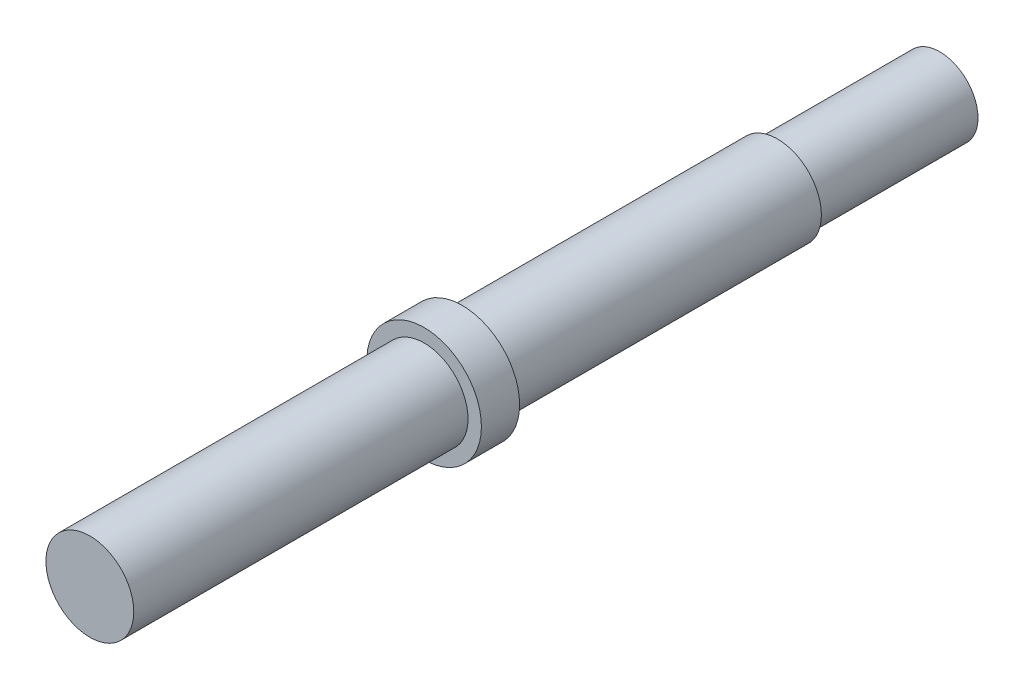
ISO-10303-21;
HEADER;
FILE_DESCRIPTION(('STEP AP214'),'2;1');
FILE_NAME('part.step','',(''),(''),'','','');
FILE_SCHEMA(('AUTOMOTIVE_DESIGN { 1 0 10303 214 1 1 1 1 }'));
ENDSEC;
DATA;
#1=APPLICATION_CONTEXT('core data for automotive mechanical design processes');
#2=APPLICATION_PROTOCOL_DEFINITION('international standard','automotive_design',2000,#1);
#3=PRODUCT_CONTEXT('',#1,'mechanical');
#4=PRODUCT('Part','Part','',(#3));
#5=PRODUCT_RELATED_PRODUCT_CATEGORY('part','',(#4));
#6=PRODUCT_DEFINITION_FORMATION('','',#4);
#7=PRODUCT_DEFINITION_CONTEXT('part definition',#1,'design');
#8=PRODUCT_DEFINITION('design','',#6,#7);
#9=PRODUCT_DEFINITION_SHAPE('','',#8);
#10=(LENGTH_UNIT() NAMED_UNIT(*) SI_UNIT(.MILLI.,.METRE.));
#11=(NAMED_UNIT(*) PLANE_ANGLE_UNIT() SI_UNIT($,.RADIAN.));
#12=(NAMED_UNIT(*) SI_UNIT($,.STERADIAN.) SOLID_ANGLE_UNIT());
#13=UNCERTAINTY_MEASURE_WITH_UNIT(LENGTH_MEASURE(1.E-05),#10,'distance_accuracy_value','');
#14=(GEOMETRIC_REPRESENTATION_CONTEXT(3) GLOBAL_UNCERTAINTY_ASSIGNED_CONTEXT((#13)) GLOBAL_UNIT_ASSIGNED_CONTEXT((#10,
#11,#12)) REPRESENTATION_CONTEXT('',''));
#15=CARTESIAN_POINT('',(0.,0.,0.));
#16=DIRECTION('',(0.,0.,1.));
#17=DIRECTION('',(1.,0.,0.));
#18=AXIS2_PLACEMENT_3D('',#15,#16,#17);
#19=CARTESIAN_POINT('',(0.,0.,84.));
#20=DIRECTION('',(0.,0.,-1.));
#21=DIRECTION('',(-1.,0.,0.));
#22=AXIS2_PLACEMENT_3D('',#19,#20,#21);
#23=CYLINDRICAL_SURFACE('',#22,4.6);
#24=CARTESIAN_POINT('',(0.,0.,12.));
#25=DIRECTION('',(0.,0.,1.));
#26=DIRECTION('',(1.,0.,0.));
#27=AXIS2_PLACEMENT_3D('',#24,#25,#26);
#28=CIRCLE('',#27,4.6);
#29=CARTESIAN_POINT('',(4.6,0.,12.));
#30=VERTEX_POINT('',#29);
#31=EDGE_CURVE('E65',#30,#30,#28,.T.);
#32=ORIENTED_EDGE('',*,*,#31,.T.);
#33=EDGE_LOOP('',(#32));
#34=FACE_BOUND('',#33,.T.);
#35=CARTESIAN_POINT('',(0.,0.,45.));
#36=DIRECTION('',(0.,0.,1.));
#37=DIRECTION('',(1.,0.,0.));
#38=AXIS2_PLACEMENT_3D('',#35,#36,#37);
#39=CIRCLE('',#38,4.6);
#40=CARTESIAN_POINT('',(4.6,0.,45.));
#41=VERTEX_POINT('',#40);
#42=EDGE_CURVE('E10',#41,#41,#39,.T.);
#43=ORIENTED_EDGE('',*,*,#42,.F.);
#44=EDGE_LOOP('',(#43));
#45=FACE_BOUND('',#44,.T.);
#46=ADVANCED_FACE('F43',(#34,#45),#23,.T.);
#47=CARTESIAN_POINT('',(0.,0.,-5.));
#48=DIRECTION('',(0.,0.,1.));
#49=DIRECTION('',(1.,0.,0.));
#50=AXIS2_PLACEMENT_3D('',#47,#48,#49);
#51=CYLINDRICAL_SURFACE('',#50,4.);
#52=CARTESIAN_POINT('',(0.,0.,-5.));
#53=DIRECTION('',(0.,0.,1.));
#54=DIRECTION('',(1.,0.,0.));
#55=AXIS2_PLACEMENT_3D('',#52,#53,#54);
#56=CIRCLE('',#55,4.);
#57=CARTESIAN_POINT('',(4.,0.,-5.));
#58=VERTEX_POINT('',#57);
#59=EDGE_CURVE('E51',#58,#58,#56,.T.);
#60=ORIENTED_EDGE('',*,*,#59,.T.);
#61=EDGE_LOOP('',(#60));
#62=FACE_BOUND('',#61,.T.);
#63=CARTESIAN_POINT('',(0.,0.,12.));
#64=DIRECTION('',(0.,0.,1.));
#65=DIRECTION('',(1.,0.,0.));
#66=AXIS2_PLACEMENT_3D('',#63,#64,#65);
#67=CIRCLE('',#66,4.);
#68=CARTESIAN_POINT('',(4.,0.,12.));
#69=VERTEX_POINT('',#68);
#70=EDGE_CURVE('E56',#69,#69,#67,.T.);
#71=ORIENTED_EDGE('',*,*,#70,.F.);
#72=EDGE_LOOP('',(#71));
#73=FACE_BOUND('',#72,.T.);
#74=ADVANCED_FACE('F45',(#62,#73),#51,.T.);
#75=CARTESIAN_POINT('',(0.,0.,-5.));
#76=DIRECTION('',(0.,0.,1.));
#77=DIRECTION('',(1.,0.,0.));
#78=AXIS2_PLACEMENT_3D('',#75,#76,#77);
#79=PLANE('',#78);
#80=ORIENTED_EDGE('',*,*,#59,.F.);
#81=EDGE_LOOP('',(#80));
#82=FACE_BOUND('',#81,.T.);
#83=ADVANCED_FACE('F107',(#82),#79,.F.);
#84=CARTESIAN_POINT('',(0.,0.,12.));
#85=DIRECTION('',(0.,0.,1.));
#86=DIRECTION('',(1.,0.,0.));
#87=AXIS2_PLACEMENT_3D('',#84,#85,#86);
#88=PLANE('',#87);
#89=ORIENTED_EDGE('',*,*,#70,.T.);
#90=EDGE_LOOP('',(#89));
#91=FACE_BOUND('',#90,.T.);
#92=ORIENTED_EDGE('',*,*,#31,.F.);
#93=EDGE_LOOP('',(#92));
#94=FACE_BOUND('',#93,.T.);
#95=ADVANCED_FACE('F111',(#91,#94),#88,.F.);
#96=CARTESIAN_POINT('',(0.,0.,45.));
#97=DIRECTION('',(0.,0.,1.));
#98=DIRECTION('',(1.,0.,0.));
#99=AXIS2_PLACEMENT_3D('',#96,#97,#98);
#100=CYLINDRICAL_SURFACE('',#99,6.);
#101=CARTESIAN_POINT('',(0.,0.,45.));
#102=DIRECTION('',(0.,0.,1.));
#103=DIRECTION('',(1.,0.,0.));
#104=AXIS2_PLACEMENT_3D('',#101,#102,#103);
#105=CIRCLE('',#104,6.);
#106=CARTESIAN_POINT('',(6.,0.,45.));
#107=VERTEX_POINT('',#106);
#108=EDGE_CURVE('E70',#107,#107,#105,.T.);
#109=ORIENTED_EDGE('',*,*,#108,.T.);
#110=EDGE_LOOP('',(#109));
#111=FACE_BOUND('',#110,.T.);
#112=CARTESIAN_POINT('',(0.,0.,49.));
#113=DIRECTION('',(0.,0.,1.));
#114=DIRECTION('',(1.,0.,0.));
#115=AXIS2_PLACEMENT_3D('',#112,#113,#114);
#116=CIRCLE('',#115,6.);
#117=CARTESIAN_POINT('',(6.,0.,49.));
#118=VERTEX_POINT('',#117);
#119=EDGE_CURVE('E77',#118,#118,#116,.T.);
#120=ORIENTED_EDGE('',*,*,#119,.F.);
#121=EDGE_LOOP('',(#120));
#122=FACE_BOUND('',#121,.T.);
#123=ADVANCED_FACE('F112',(#111,#122),#100,.T.);
#124=CARTESIAN_POINT('',(0.,0.,45.));
#125=DIRECTION('',(0.,0.,1.));
#126=DIRECTION('',(1.,0.,0.));
#127=AXIS2_PLACEMENT_3D('',#124,#125,#126);
#128=PLANE('',#127);
#129=ORIENTED_EDGE('',*,*,#42,.T.);
#130=EDGE_LOOP('',(#129));
#131=FACE_BOUND('',#130,.T.);
#132=ORIENTED_EDGE('',*,*,#108,.F.);
#133=EDGE_LOOP('',(#132));
#134=FACE_BOUND('',#133,.T.);
#135=ADVANCED_FACE('F116',(#131,#134),#128,.F.);
#136=CARTESIAN_POINT('',(0.,0.,49.));
#137=DIRECTION('',(0.,0.,1.));
#138=DIRECTION('',(1.,0.,0.));
#139=AXIS2_PLACEMENT_3D('',#136,#137,#138);
#140=PLANE('',#139);
#141=CARTESIAN_POINT('',(0.,0.,49.));
#142=DIRECTION('',(0.,0.,1.));
#143=DIRECTION('',(1.,0.,0.));
#144=AXIS2_PLACEMENT_3D('',#141,#142,#143);
#145=CIRCLE('',#144,4.6);
#146=CARTESIAN_POINT('',(4.6,0.,49.));
#147=VERTEX_POINT('',#146);
#148=EDGE_CURVE('E67',#147,#147,#145,.T.);
#149=ORIENTED_EDGE('',*,*,#148,.F.);
#150=EDGE_LOOP('',(#149));
#151=FACE_BOUND('',#150,.T.);
#152=ORIENTED_EDGE('',*,*,#119,.T.);
#153=EDGE_LOOP('',(#152));
#154=FACE_BOUND('',#153,.T.);
#155=ADVANCED_FACE('F97',(#151,#154),#140,.T.);
#156=CARTESIAN_POINT('',(0.,0.,84.));
#157=DIRECTION('',(0.,0.,1.));
#158=DIRECTION('',(1.,0.,0.));
#159=AXIS2_PLACEMENT_3D('',#156,#157,#158);
#160=PLANE('',#159);
#161=CARTESIAN_POINT('',(0.,0.,84.));
#162=DIRECTION('',(0.,0.,1.));
#163=DIRECTION('',(1.,0.,0.));
#164=AXIS2_PLACEMENT_3D('',#161,#162,#163);
#165=CIRCLE('',#164,4.6);
#166=CARTESIAN_POINT('',(4.6,0.,84.));
#167=VERTEX_POINT('',#166);
#168=EDGE_CURVE('E62',#167,#167,#165,.T.);
#169=ORIENTED_EDGE('',*,*,#168,.T.);
#170=EDGE_LOOP('',(#169));
#171=FACE_BOUND('',#170,.T.);
#172=ADVANCED_FACE('F88',(#171),#160,.T.);
#173=ORIENTED_EDGE('',*,*,#148,.T.);
#174=EDGE_LOOP('',(#173));
#175=FACE_BOUND('',#174,.T.);
#176=ORIENTED_EDGE('',*,*,#168,.F.);
#177=EDGE_LOOP('',(#176));
#178=FACE_BOUND('',#177,.T.);
#179=ADVANCED_FACE('F90',(#175,#178),#23,.T.);
#180=CLOSED_SHELL('',(#46,#74,#83,#95,#123,#135,#155,#172,#179));
#181=MANIFOLD_SOLID_BREP('B2',#180);
#182=ADVANCED_BREP_SHAPE_REPRESENTATION('',(#18,#181),#14);
#183=SHAPE_DEFINITION_REPRESENTATION(#9,#182);
ENDSEC;
END-ISO-10303-21;
